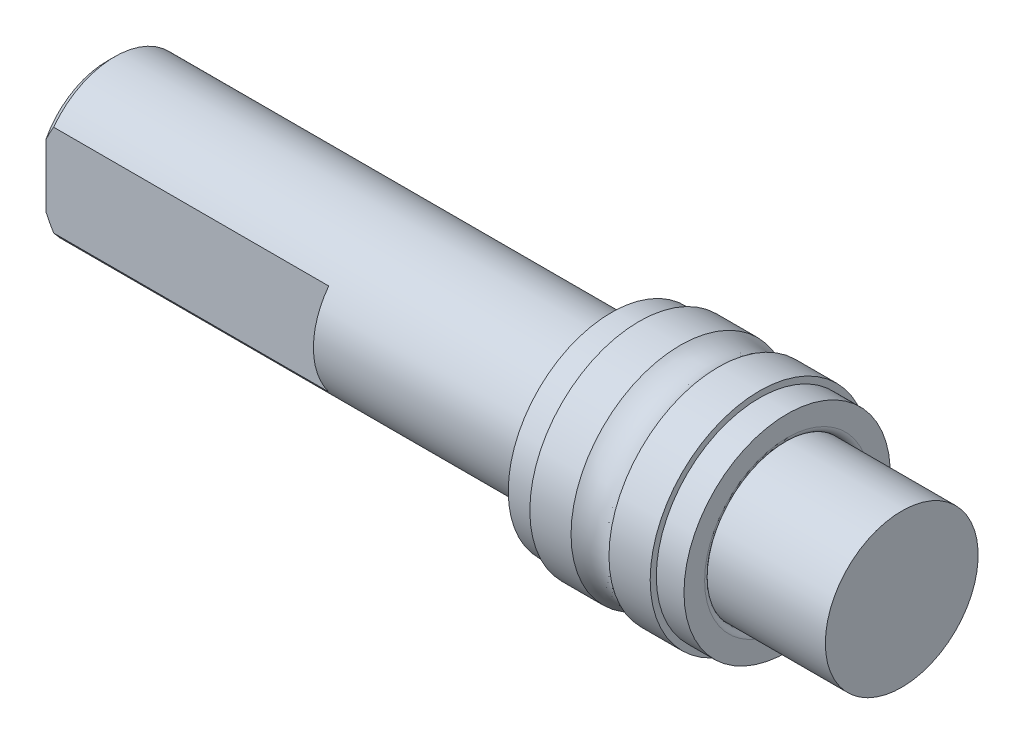
ISO-10303-21;
HEADER;
FILE_DESCRIPTION(('STEP AP214'),'2;1');
FILE_NAME('part.step','',(''),(''),'','','');
FILE_SCHEMA(('AUTOMOTIVE_DESIGN { 1 0 10303 214 1 1 1 1 }'));
ENDSEC;
DATA;
#1=APPLICATION_CONTEXT('core data for automotive mechanical design processes');
#2=APPLICATION_PROTOCOL_DEFINITION('international standard','automotive_design',2000,#1);
#3=PRODUCT_CONTEXT('',#1,'mechanical');
#4=PRODUCT('Part','Part','',(#3));
#5=PRODUCT_RELATED_PRODUCT_CATEGORY('part','',(#4));
#6=PRODUCT_DEFINITION_FORMATION('','',#4);
#7=PRODUCT_DEFINITION_CONTEXT('part definition',#1,'design');
#8=PRODUCT_DEFINITION('design','',#6,#7);
#9=PRODUCT_DEFINITION_SHAPE('','',#8);
#10=(LENGTH_UNIT() NAMED_UNIT(*) SI_UNIT(.MILLI.,.METRE.));
#11=(NAMED_UNIT(*) PLANE_ANGLE_UNIT() SI_UNIT($,.RADIAN.));
#12=(NAMED_UNIT(*) SI_UNIT($,.STERADIAN.) SOLID_ANGLE_UNIT());
#13=UNCERTAINTY_MEASURE_WITH_UNIT(LENGTH_MEASURE(1.E-05),#10,'distance_accuracy_value','');
#14=(GEOMETRIC_REPRESENTATION_CONTEXT(3) GLOBAL_UNCERTAINTY_ASSIGNED_CONTEXT((#13)) GLOBAL_UNIT_ASSIGNED_CONTEXT((#10,
#11,#12)) REPRESENTATION_CONTEXT('',''));
#15=CARTESIAN_POINT('',(0.,0.,0.));
#16=DIRECTION('',(0.,0.,1.));
#17=DIRECTION('',(1.,0.,0.));
#18=AXIS2_PLACEMENT_3D('',#15,#16,#17);
#19=CARTESIAN_POINT('',(0.,0.5,0.));
#20=DIRECTION('',(1.,0.,0.));
#21=DIRECTION('',(0.,0.,-1.));
#22=AXIS2_PLACEMENT_3D('',#19,#20,#21);
#23=PLANE('',#22);
#24=CARTESIAN_POINT('',(0.,0.,0.));
#25=DIRECTION('',(-1.,0.,0.));
#26=DIRECTION('',(0.,0.,1.));
#27=AXIS2_PLACEMENT_3D('',#24,#25,#26);
#28=CIRCLE('',#27,1.);
#29=CARTESIAN_POINT('',(0.,0.,1.));
#30=VERTEX_POINT('',#29);
#31=EDGE_CURVE('E211',#30,#30,#28,.T.);
#32=ORIENTED_EDGE('',*,*,#31,.F.);
#33=EDGE_LOOP('',(#32));
#34=FACE_BOUND('',#33,.T.);
#35=ADVANCED_FACE('F16',(#34),#23,.T.);
#36=CARTESIAN_POINT('',(-5.2,0.,0.));
#37=DIRECTION('',(-1.,0.,0.));
#38=DIRECTION('',(0.,0.,1.));
#39=AXIS2_PLACEMENT_3D('',#36,#37,#38);
#40=CYLINDRICAL_SURFACE('',#39,1.);
#41=ORIENTED_EDGE('',*,*,#31,.T.);
#42=EDGE_LOOP('',(#41));
#43=FACE_BOUND('',#42,.T.);
#44=CARTESIAN_POINT('',(-1.58,0.,0.));
#45=DIRECTION('',(1.,0.,0.));
#46=DIRECTION('',(0.,0.,1.));
#47=AXIS2_PLACEMENT_3D('',#44,#45,#46);
#48=CIRCLE('',#47,1.);
#49=CARTESIAN_POINT('',(-1.58,0.,1.));
#50=VERTEX_POINT('',#49);
#51=EDGE_CURVE('E203',#50,#50,#48,.F.);
#52=ORIENTED_EDGE('',*,*,#51,.F.);
#53=EDGE_LOOP('',(#52));
#54=FACE_BOUND('',#53,.T.);
#55=ADVANCED_FACE('F252',(#43,#54),#40,.T.);
#56=CARTESIAN_POINT('',(-1.58,0.,0.));
#57=DIRECTION('',(1.,0.,0.));
#58=DIRECTION('',(0.,0.,1.));
#59=AXIS2_PLACEMENT_3D('',#56,#57,#58);
#60=TOROIDAL_SURFACE('',#59,1.08,0.0799999999999996);
#61=CARTESIAN_POINT('',(-1.5,0.,0.));
#62=DIRECTION('',(1.,0.,0.));
#63=DIRECTION('',(0.,0.,-1.));
#64=AXIS2_PLACEMENT_3D('',#61,#62,#63);
#65=CIRCLE('',#64,1.08);
#66=CARTESIAN_POINT('',(-1.5,0.,1.08));
#67=VERTEX_POINT('',#66);
#68=CARTESIAN_POINT('',(-1.5,0.,-1.08));
#69=VERTEX_POINT('',#68);
#70=EDGE_CURVE('E170',#67,#69,#65,.F.);
#71=ORIENTED_EDGE('',*,*,#70,.F.);
#72=CARTESIAN_POINT('',(-1.5,0.,0.));
#73=DIRECTION('',(1.,0.,0.));
#74=DIRECTION('',(0.,0.,1.));
#75=AXIS2_PLACEMENT_3D('',#72,#73,#74);
#76=CIRCLE('',#75,1.08);
#77=EDGE_CURVE('E62',#69,#67,#76,.F.);
#78=ORIENTED_EDGE('',*,*,#77,.F.);
#79=EDGE_LOOP('',(#71,#78));
#80=FACE_BOUND('',#79,.T.);
#81=ORIENTED_EDGE('',*,*,#51,.T.);
#82=EDGE_LOOP('',(#81));
#83=FACE_BOUND('',#82,.T.);
#84=ADVANCED_FACE('F186',(#80,#83),#60,.T.);
#85=CARTESIAN_POINT('',(-1.5,0.,-1.215));
#86=DIRECTION('',(1.,0.,0.));
#87=DIRECTION('',(0.,0.,-1.));
#88=AXIS2_PLACEMENT_3D('',#85,#86,#87);
#89=PLANE('',#88);
#90=CARTESIAN_POINT('',(-1.5,0.,0.));
#91=DIRECTION('',(-1.,0.,0.));
#92=DIRECTION('',(0.,0.,1.));
#93=AXIS2_PLACEMENT_3D('',#90,#91,#92);
#94=CIRCLE('',#93,1.35);
#95=CARTESIAN_POINT('',(-1.5,0.,1.35));
#96=VERTEX_POINT('',#95);
#97=EDGE_CURVE('E238',#96,#96,#94,.T.);
#98=ORIENTED_EDGE('',*,*,#97,.F.);
#99=EDGE_LOOP('',(#98));
#100=FACE_BOUND('',#99,.T.);
#101=ORIENTED_EDGE('',*,*,#70,.T.);
#102=ORIENTED_EDGE('',*,*,#77,.T.);
#103=EDGE_LOOP('',(#101,#102));
#104=FACE_BOUND('',#103,.T.);
#105=ADVANCED_FACE('F176',(#100,#104),#89,.T.);
#106=CARTESIAN_POINT('',(-1.68125,0.,0.));
#107=DIRECTION('',(-1.,0.,0.));
#108=DIRECTION('',(0.,0.,1.));
#109=AXIS2_PLACEMENT_3D('',#106,#107,#108);
#110=CYLINDRICAL_SURFACE('',#109,1.35);
#111=ORIENTED_EDGE('',*,*,#97,.T.);
#112=EDGE_LOOP('',(#111));
#113=FACE_BOUND('',#112,.T.);
#114=CARTESIAN_POINT('',(-1.8625,0.,0.));
#115=DIRECTION('',(-1.,0.,0.));
#116=DIRECTION('',(0.,0.,1.));
#117=AXIS2_PLACEMENT_3D('',#114,#115,#116);
#118=CIRCLE('',#117,1.35);
#119=CARTESIAN_POINT('',(-1.8625,0.,1.35));
#120=VERTEX_POINT('',#119);
#121=EDGE_CURVE('E235',#120,#120,#118,.T.);
#122=ORIENTED_EDGE('',*,*,#121,.F.);
#123=EDGE_LOOP('',(#122));
#124=FACE_BOUND('',#123,.T.);
#125=ADVANCED_FACE('F185',(#113,#124),#110,.T.);
#126=CARTESIAN_POINT('',(-1.8625,0.,-1.39));
#127=DIRECTION('',(1.,0.,0.));
#128=DIRECTION('',(0.,0.,-1.));
#129=AXIS2_PLACEMENT_3D('',#126,#127,#128);
#130=PLANE('',#129);
#131=CARTESIAN_POINT('',(-1.8625,0.,0.));
#132=DIRECTION('',(-1.,0.,0.));
#133=DIRECTION('',(0.,0.,1.));
#134=AXIS2_PLACEMENT_3D('',#131,#132,#133);
#135=CIRCLE('',#134,1.43);
#136=CARTESIAN_POINT('',(-1.8625,0.,1.43));
#137=VERTEX_POINT('',#136);
#138=EDGE_CURVE('E167',#137,#137,#135,.T.);
#139=ORIENTED_EDGE('',*,*,#138,.F.);
#140=EDGE_LOOP('',(#139));
#141=FACE_BOUND('',#140,.T.);
#142=ORIENTED_EDGE('',*,*,#121,.T.);
#143=EDGE_LOOP('',(#142));
#144=FACE_BOUND('',#143,.T.);
#145=ADVANCED_FACE('F364',(#141,#144),#130,.T.);
#146=CARTESIAN_POINT('',(-2.13215326354009,0.,0.));
#147=DIRECTION('',(-1.,0.,0.));
#148=DIRECTION('',(0.,0.,1.));
#149=AXIS2_PLACEMENT_3D('',#146,#147,#148);
#150=CYLINDRICAL_SURFACE('',#149,1.43);
#151=ORIENTED_EDGE('',*,*,#138,.T.);
#152=EDGE_LOOP('',(#151));
#153=FACE_BOUND('',#152,.T.);
#154=CARTESIAN_POINT('',(-2.40180652708018,0.,0.));
#155=DIRECTION('',(1.,0.,0.));
#156=DIRECTION('',(0.,0.,1.));
#157=AXIS2_PLACEMENT_3D('',#154,#155,#156);
#158=CIRCLE('',#157,1.43);
#159=CARTESIAN_POINT('',(-2.40180652708018,0.,1.43));
#160=VERTEX_POINT('',#159);
#161=EDGE_CURVE('E164',#160,#160,#158,.T.);
#162=ORIENTED_EDGE('',*,*,#161,.T.);
#163=EDGE_LOOP('',(#162));
#164=FACE_BOUND('',#163,.T.);
#165=ADVANCED_FACE('F157',(#153,#164),#150,.T.);
#166=CARTESIAN_POINT('',(-2.65,0.,0.));
#167=DIRECTION('',(1.,0.,0.));
#168=DIRECTION('',(0.,0.,1.));
#169=AXIS2_PLACEMENT_3D('',#166,#167,#168);
#170=TOROIDAL_SURFACE('',#169,1.775,0.424999999999999);
#171=ORIENTED_EDGE('',*,*,#161,.F.);
#172=EDGE_LOOP('',(#171));
#173=FACE_BOUND('',#172,.T.);
#174=CARTESIAN_POINT('',(-2.89819347291982,0.,0.));
#175=DIRECTION('',(-1.,0.,0.));
#176=DIRECTION('',(0.,0.,1.));
#177=AXIS2_PLACEMENT_3D('',#174,#175,#176);
#178=CIRCLE('',#177,1.43);
#179=CARTESIAN_POINT('',(-2.89819347291982,0.,1.43));
#180=VERTEX_POINT('',#179);
#181=EDGE_CURVE('E163',#180,#180,#178,.T.);
#182=ORIENTED_EDGE('',*,*,#181,.F.);
#183=EDGE_LOOP('',(#182));
#184=FACE_BOUND('',#183,.T.);
#185=ADVANCED_FACE('F152',(#173,#184),#170,.F.);
#186=CARTESIAN_POINT('',(-3.16784673645991,0.,0.));
#187=DIRECTION('',(-1.,0.,0.));
#188=DIRECTION('',(0.,0.,1.));
#189=AXIS2_PLACEMENT_3D('',#186,#187,#188);
#190=CYLINDRICAL_SURFACE('',#189,1.43);
#191=ORIENTED_EDGE('',*,*,#181,.T.);
#192=EDGE_LOOP('',(#191));
#193=FACE_BOUND('',#192,.T.);
#194=CARTESIAN_POINT('',(-3.4375,0.,0.));
#195=DIRECTION('',(-1.,0.,0.));
#196=DIRECTION('',(0.,0.,1.));
#197=AXIS2_PLACEMENT_3D('',#194,#195,#196);
#198=CIRCLE('',#197,1.43);
#199=CARTESIAN_POINT('',(-3.4375,0.,1.43));
#200=VERTEX_POINT('',#199);
#201=EDGE_CURVE('E230',#200,#200,#198,.T.);
#202=ORIENTED_EDGE('',*,*,#201,.F.);
#203=EDGE_LOOP('',(#202));
#204=FACE_BOUND('',#203,.T.);
#205=ADVANCED_FACE('F148',(#193,#204),#190,.T.);
#206=CARTESIAN_POINT('',(-3.4375,0.,-1.39));
#207=DIRECTION('',(-1.,0.,0.));
#208=DIRECTION('',(0.,0.,1.));
#209=AXIS2_PLACEMENT_3D('',#206,#207,#208);
#210=PLANE('',#209);
#211=CARTESIAN_POINT('',(-3.4375,0.,0.));
#212=DIRECTION('',(-1.,0.,0.));
#213=DIRECTION('',(0.,0.,1.));
#214=AXIS2_PLACEMENT_3D('',#211,#212,#213);
#215=CIRCLE('',#214,1.35);
#216=CARTESIAN_POINT('',(-3.4375,0.,1.35));
#217=VERTEX_POINT('',#216);
#218=EDGE_CURVE('E222',#217,#217,#215,.T.);
#219=ORIENTED_EDGE('',*,*,#218,.F.);
#220=EDGE_LOOP('',(#219));
#221=FACE_BOUND('',#220,.T.);
#222=ORIENTED_EDGE('',*,*,#201,.T.);
#223=EDGE_LOOP('',(#222));
#224=FACE_BOUND('',#223,.T.);
#225=ADVANCED_FACE('F144',(#221,#224),#210,.T.);
#226=CARTESIAN_POINT('',(-3.61875,0.,0.));
#227=DIRECTION('',(-1.,0.,0.));
#228=DIRECTION('',(0.,0.,1.));
#229=AXIS2_PLACEMENT_3D('',#226,#227,#228);
#230=CYLINDRICAL_SURFACE('',#229,1.35);
#231=ORIENTED_EDGE('',*,*,#218,.T.);
#232=EDGE_LOOP('',(#231));
#233=FACE_BOUND('',#232,.T.);
#234=CARTESIAN_POINT('',(-3.8,0.,0.));
#235=DIRECTION('',(-1.,0.,0.));
#236=DIRECTION('',(0.,0.,1.));
#237=AXIS2_PLACEMENT_3D('',#234,#235,#236);
#238=CIRCLE('',#237,1.35);
#239=CARTESIAN_POINT('',(-3.8,0.,1.35));
#240=VERTEX_POINT('',#239);
#241=EDGE_CURVE('E81',#240,#240,#238,.T.);
#242=ORIENTED_EDGE('',*,*,#241,.F.);
#243=EDGE_LOOP('',(#242));
#244=FACE_BOUND('',#243,.T.);
#245=ADVANCED_FACE('F140',(#233,#244),#230,.T.);
#246=CARTESIAN_POINT('',(-10.4,0.5,0.));
#247=DIRECTION('',(-1.,0.,0.));
#248=DIRECTION('',(0.,0.,1.));
#249=AXIS2_PLACEMENT_3D('',#246,#247,#248);
#250=PLANE('',#249);
#251=CARTESIAN_POINT('',(-10.4000000000042,0.,0.));
#252=DIRECTION('',(1.,0.,0.));
#253=DIRECTION('',(0.,0.,-1.));
#254=AXIS2_PLACEMENT_3D('',#251,#252,#253);
#255=CIRCLE('',#254,0.900000000001455);
#256=CARTESIAN_POINT('',(-10.4000000000045,-0.412310562564215,0.8));
#257=VERTEX_POINT('',#256);
#258=CARTESIAN_POINT('',(-10.4000000000021,0.412310562569507,0.8));
#259=VERTEX_POINT('',#258);
#260=EDGE_CURVE('E80',#257,#259,#255,.T.);
#261=ORIENTED_EDGE('',*,*,#260,.F.);
#262=DIRECTION('',(0.,1.,0.));
#263=VECTOR('',#262,1.);
#264=CARTESIAN_POINT('',(-10.4,0.5,0.8));
#265=LINE('',#264,#263);
#266=EDGE_CURVE('E94',#257,#259,#265,.T.);
#267=ORIENTED_EDGE('',*,*,#266,.T.);
#268=EDGE_LOOP('',(#261,#267));
#269=FACE_BOUND('',#268,.T.);
#270=ADVANCED_FACE('F135',(#269),#250,.T.);
#271=CARTESIAN_POINT('',(-3.8,0.,-1.215));
#272=DIRECTION('',(-1.,0.,0.));
#273=DIRECTION('',(0.,0.,1.));
#274=AXIS2_PLACEMENT_3D('',#271,#272,#273);
#275=PLANE('',#274);
#276=CARTESIAN_POINT('',(-3.8,0.,0.));
#277=DIRECTION('',(-1.,0.,0.));
#278=DIRECTION('',(0.,0.,1.));
#279=AXIS2_PLACEMENT_3D('',#276,#277,#278);
#280=CIRCLE('',#279,1.08);
#281=CARTESIAN_POINT('',(-3.8,0.,1.08));
#282=VERTEX_POINT('',#281);
#283=CARTESIAN_POINT('',(-3.8,0.,-1.08));
#284=VERTEX_POINT('',#283);
#285=EDGE_CURVE('E76',#282,#284,#280,.T.);
#286=ORIENTED_EDGE('',*,*,#285,.F.);
#287=CARTESIAN_POINT('',(-3.8,0.,0.));
#288=DIRECTION('',(-1.,0.,0.));
#289=DIRECTION('',(0.,0.,-1.));
#290=AXIS2_PLACEMENT_3D('',#287,#288,#289);
#291=CIRCLE('',#290,1.08);
#292=EDGE_CURVE('E71',#282,#284,#291,.F.);
#293=ORIENTED_EDGE('',*,*,#292,.T.);
#294=EDGE_LOOP('',(#286,#293));
#295=FACE_BOUND('',#294,.T.);
#296=ORIENTED_EDGE('',*,*,#241,.T.);
#297=EDGE_LOOP('',(#296));
#298=FACE_BOUND('',#297,.T.);
#299=ADVANCED_FACE('F74',(#295,#298),#275,.T.);
#300=CARTESIAN_POINT('',(-10.3000000000293,0.,0.));
#301=DIRECTION('',(1.,0.,0.));
#302=DIRECTION('',(0.,0.,-1.));
#303=AXIS2_PLACEMENT_3D('',#300,#301,#302);
#304=CONICAL_SURFACE('',#303,0.999999999976353,0.785398163397448);
#305=CARTESIAN_POINT('',(-10.3,0.,0.));
#306=DIRECTION('',(-1.,0.,0.));
#307=DIRECTION('',(0.,0.,1.));
#308=AXIS2_PLACEMENT_3D('',#305,#306,#307);
#309=CIRCLE('',#308,1.);
#310=CARTESIAN_POINT('',(-10.3000000000202,-0.599999999995406,0.8));
#311=VERTEX_POINT('',#310);
#312=CARTESIAN_POINT('',(-10.3000000000021,0.600000000001244,0.8));
#313=VERTEX_POINT('',#312);
#314=EDGE_CURVE('E53',#311,#313,#309,.F.);
#315=ORIENTED_EDGE('',*,*,#314,.F.);
#316=CARTESIAN_POINT('',(-10.3000000000112,-0.599999999990811,0.8));
#317=CARTESIAN_POINT('',(-10.309124169973,-0.584790875938181,0.8));
#318=CARTESIAN_POINT('',(-10.3180876147845,-0.569483842518553,0.8));
#319=CARTESIAN_POINT('',(-10.3356334268019,-0.538668578469111,0.8));
#320=CARTESIAN_POINT('',(-10.3442160787526,-0.523160509775717,0.8));
#321=CARTESIAN_POINT('',(-10.3609557853304,-0.491912721430752,0.8));
#322=CARTESIAN_POINT('',(-10.3691127857654,-0.476172972608135,0.8));
#323=CARTESIAN_POINT('',(-10.3849400510666,-0.444436028874582,0.8));
#324=CARTESIAN_POINT('',(-10.3926099403412,-0.428438646946304,0.8));
#325=CARTESIAN_POINT('',(-10.4000000000048,-0.412310562563488,0.8));
#326=B_SPLINE_CURVE_WITH_KNOTS('',3,(#316,#317,#318,#319,#320,#321,#322,#323,#324,#325),
.UNSPECIFIED.,.F.,.F.,(4,2,2,2,4),(0.,0.0532090214504783,0.106377560146251,0.159552851597448,
0.212768658660782),.UNSPECIFIED.);
#327=EDGE_CURVE('E225',#311,#257,#326,.T.);
#328=ORIENTED_EDGE('',*,*,#327,.T.);
#329=ORIENTED_EDGE('',*,*,#260,.T.);
#330=CARTESIAN_POINT('',(-10.4000000000048,0.412310562563694,0.8));
#331=CARTESIAN_POINT('',(-10.3926099403406,0.428438646947525,0.8));
#332=CARTESIAN_POINT('',(-10.3849400510655,0.444436028876802,0.8));
#333=CARTESIAN_POINT('',(-10.3691127857633,0.476172972612319,0.8));
#334=CARTESIAN_POINT('',(-10.3609557853278,0.491912721435902,0.8));
#335=CARTESIAN_POINT('',(-10.3442160787488,0.523160509782774,0.8));
#336=CARTESIAN_POINT('',(-10.3356334267975,0.538668578477107,0.8));
#337=CARTESIAN_POINT('',(-10.3180876147788,0.569483842528405,0.8));
#338=CARTESIAN_POINT('',(-10.3091241699666,0.58479087594895,0.8));
#339=CARTESIAN_POINT('',(-10.3000000000041,0.600000000002488,0.8));
#340=B_SPLINE_CURVE_WITH_KNOTS('',3,(#330,#331,#332,#333,#334,#335,#336,#337,#338,#339),
.UNSPECIFIED.,.F.,.F.,(4,2,2,2,4),(0.,0.0532158070666863,0.106391098521228,0.159559637220345,
0.212768658674172),.UNSPECIFIED.);
#341=EDGE_CURVE('E117',#259,#313,#340,.T.);
#342=ORIENTED_EDGE('',*,*,#341,.T.);
#343=EDGE_LOOP('',(#315,#328,#329,#342));
#344=FACE_BOUND('',#343,.T.);
#345=ADVANCED_FACE('F134',(#344),#304,.T.);
#346=CARTESIAN_POINT('',(-6.7,1.,1.));
#347=DIRECTION('',(1.,0.,0.));
#348=DIRECTION('',(0.,0.,-1.));
#349=AXIS2_PLACEMENT_3D('',#346,#347,#348);
#350=PLANE('',#349);
#351=DIRECTION('',(0.,1.,0.));
#352=VECTOR('',#351,1.);
#353=CARTESIAN_POINT('',(-6.7,1.,0.8));
#354=LINE('',#353,#352);
#355=CARTESIAN_POINT('',(-6.7,0.6,0.8));
#356=VERTEX_POINT('',#355);
#357=CARTESIAN_POINT('',(-6.7,-0.6,0.8));
#358=VERTEX_POINT('',#357);
#359=EDGE_CURVE('E35',#356,#358,#354,.F.);
#360=ORIENTED_EDGE('',*,*,#359,.T.);
#361=CARTESIAN_POINT('',(-6.7,0.,0.));
#362=DIRECTION('',(-1.,0.,0.));
#363=DIRECTION('',(0.,0.,1.));
#364=AXIS2_PLACEMENT_3D('',#361,#362,#363);
#365=CIRCLE('',#364,1.);
#366=EDGE_CURVE('E115',#356,#358,#365,.F.);
#367=ORIENTED_EDGE('',*,*,#366,.F.);
#368=EDGE_LOOP('',(#360,#367));
#369=FACE_BOUND('',#368,.T.);
#370=ADVANCED_FACE('F273',(#369),#350,.F.);
#371=CARTESIAN_POINT('',(-6.7,1.,0.8));
#372=DIRECTION('',(0.,0.,-1.));
#373=DIRECTION('',(-1.,0.,0.));
#374=AXIS2_PLACEMENT_3D('',#371,#372,#373);
#375=PLANE('',#374);
#376=DIRECTION('',(-1.,0.,0.));
#377=VECTOR('',#376,1.);
#378=CARTESIAN_POINT('',(-5.2,-0.6,0.8));
#379=LINE('',#378,#377);
#380=EDGE_CURVE('E27',#358,#311,#379,.T.);
#381=ORIENTED_EDGE('',*,*,#380,.F.);
#382=ORIENTED_EDGE('',*,*,#359,.F.);
#383=DIRECTION('',(-1.,0.,0.));
#384=VECTOR('',#383,1.);
#385=CARTESIAN_POINT('',(-5.2,0.6,0.8));
#386=LINE('',#385,#384);
#387=EDGE_CURVE('E118',#313,#356,#386,.F.);
#388=ORIENTED_EDGE('',*,*,#387,.F.);
#389=ORIENTED_EDGE('',*,*,#341,.F.);
#390=ORIENTED_EDGE('',*,*,#266,.F.);
#391=ORIENTED_EDGE('',*,*,#327,.F.);
#392=EDGE_LOOP('',(#381,#382,#388,#389,#390,#391));
#393=FACE_BOUND('',#392,.T.);
#394=ADVANCED_FACE('F106',(#393),#375,.F.);
#395=CARTESIAN_POINT('',(-3.72,0.,0.));
#396=DIRECTION('',(1.,0.,0.));
#397=DIRECTION('',(0.,0.,1.));
#398=AXIS2_PLACEMENT_3D('',#395,#396,#397);
#399=TOROIDAL_SURFACE('',#398,1.08,0.08);
#400=CARTESIAN_POINT('',(-3.72,0.,0.));
#401=DIRECTION('',(-1.,0.,0.));
#402=DIRECTION('',(0.,0.,1.));
#403=AXIS2_PLACEMENT_3D('',#400,#401,#402);
#404=CIRCLE('',#403,1.);
#405=CARTESIAN_POINT('',(-3.72,0.,1.));
#406=VERTEX_POINT('',#405);
#407=EDGE_CURVE('E11',#406,#406,#404,.T.);
#408=ORIENTED_EDGE('',*,*,#407,.F.);
#409=EDGE_LOOP('',(#408));
#410=FACE_BOUND('',#409,.T.);
#411=ORIENTED_EDGE('',*,*,#292,.F.);
#412=ORIENTED_EDGE('',*,*,#285,.T.);
#413=EDGE_LOOP('',(#411,#412));
#414=FACE_BOUND('',#413,.T.);
#415=ADVANCED_FACE('F85',(#410,#414),#399,.T.);
#416=CARTESIAN_POINT('',(-5.2,0.,0.));
#417=DIRECTION('',(-1.,0.,0.));
#418=DIRECTION('',(0.,0.,1.));
#419=AXIS2_PLACEMENT_3D('',#416,#417,#418);
#420=CYLINDRICAL_SURFACE('',#419,1.);
#421=ORIENTED_EDGE('',*,*,#407,.T.);
#422=EDGE_LOOP('',(#421));
#423=FACE_BOUND('',#422,.T.);
#424=ORIENTED_EDGE('',*,*,#380,.T.);
#425=ORIENTED_EDGE('',*,*,#314,.T.);
#426=ORIENTED_EDGE('',*,*,#387,.T.);
#427=ORIENTED_EDGE('',*,*,#366,.T.);
#428=EDGE_LOOP('',(#424,#425,#426,#427));
#429=FACE_BOUND('',#428,.T.);
#430=ADVANCED_FACE('F105',(#423,#429),#420,.T.);
#431=CLOSED_SHELL('',(#35,#55,#84,#105,#125,#145,#165,#185,#205,#225,#245,#270,#299,#345,#370,
#394,#415,#430));
#432=MANIFOLD_SOLID_BREP('B1',#431);
#433=ADVANCED_BREP_SHAPE_REPRESENTATION('',(#18,#432),#14);
#434=SHAPE_DEFINITION_REPRESENTATION(#9,#433);
ENDSEC;
END-ISO-10303-21;
